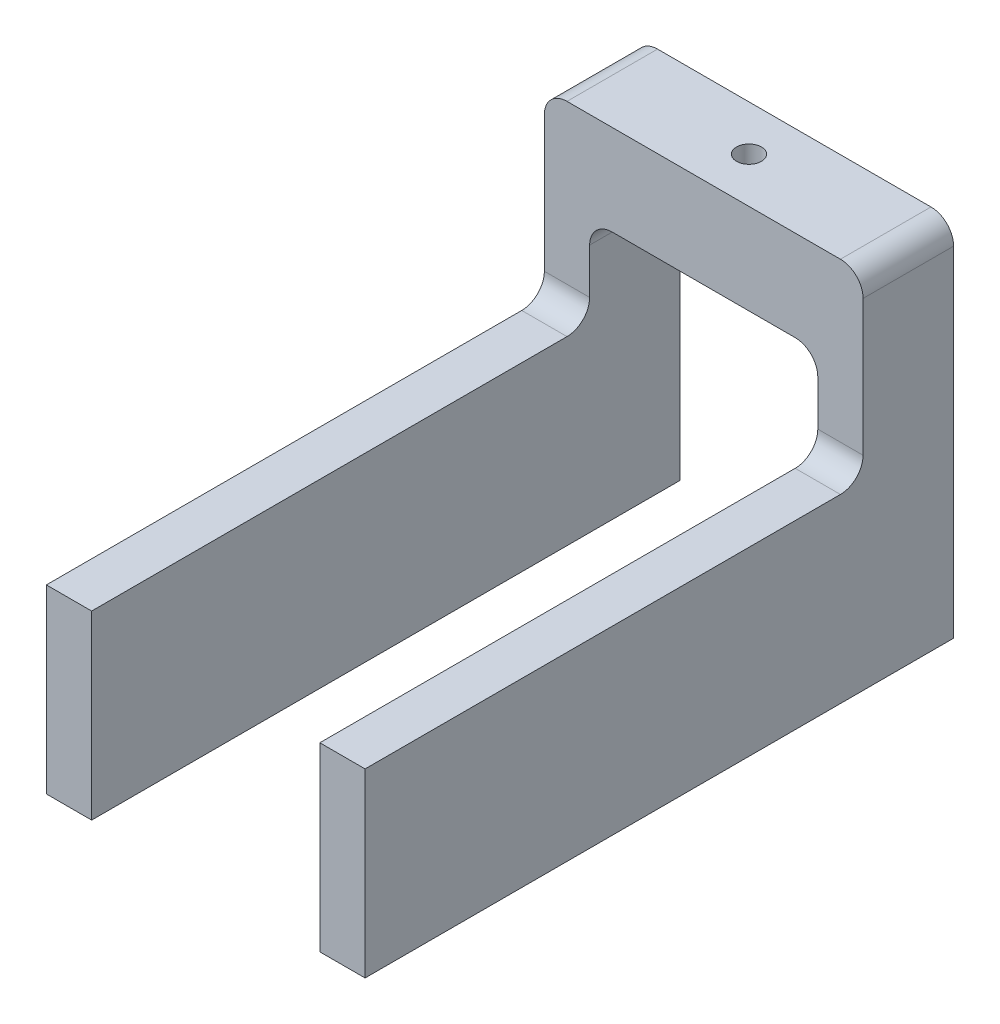
ISO-10303-21;
HEADER;
FILE_DESCRIPTION(('STEP AP214'),'2;1');
FILE_NAME('part.step','',(''),(''),'','','');
FILE_SCHEMA(('AUTOMOTIVE_DESIGN { 1 0 10303 214 1 1 1 1 }'));
ENDSEC;
DATA;
#1=APPLICATION_CONTEXT('core data for automotive mechanical design processes');
#2=APPLICATION_PROTOCOL_DEFINITION('international standard','automotive_design',2000,#1);
#3=PRODUCT_CONTEXT('',#1,'mechanical');
#4=PRODUCT('Part','Part','',(#3));
#5=PRODUCT_RELATED_PRODUCT_CATEGORY('part','',(#4));
#6=PRODUCT_DEFINITION_FORMATION('','',#4);
#7=PRODUCT_DEFINITION_CONTEXT('part definition',#1,'design');
#8=PRODUCT_DEFINITION('design','',#6,#7);
#9=PRODUCT_DEFINITION_SHAPE('','',#8);
#10=(LENGTH_UNIT() NAMED_UNIT(*) SI_UNIT(.MILLI.,.METRE.));
#11=(NAMED_UNIT(*) PLANE_ANGLE_UNIT() SI_UNIT($,.RADIAN.));
#12=(NAMED_UNIT(*) SI_UNIT($,.STERADIAN.) SOLID_ANGLE_UNIT());
#13=UNCERTAINTY_MEASURE_WITH_UNIT(LENGTH_MEASURE(1.E-05),#10,'distance_accuracy_value','');
#14=(GEOMETRIC_REPRESENTATION_CONTEXT(3) GLOBAL_UNCERTAINTY_ASSIGNED_CONTEXT((#13)) GLOBAL_UNIT_ASSIGNED_CONTEXT((#10,
#11,#12)) REPRESENTATION_CONTEXT('',''));
#15=CARTESIAN_POINT('',(0.,0.,0.));
#16=DIRECTION('',(0.,0.,1.));
#17=DIRECTION('',(1.,0.,0.));
#18=AXIS2_PLACEMENT_3D('',#15,#16,#17);
#19=CARTESIAN_POINT('',(89.408,50.8,165.1));
#20=DIRECTION('',(0.,-1.,0.));
#21=DIRECTION('',(0.,0.,-1.));
#22=AXIS2_PLACEMENT_3D('',#19,#20,#21);
#23=PLANE('',#22);
#24=DIRECTION('',(0.,0.,1.));
#25=VECTOR('',#24,1.);
#26=CARTESIAN_POINT('',(89.408,50.8,165.1));
#27=LINE('',#26,#25);
#28=CARTESIAN_POINT('',(89.408,50.8,31.75));
#29=VERTEX_POINT('',#28);
#30=CARTESIAN_POINT('',(89.408,50.8,165.1));
#31=VERTEX_POINT('',#30);
#32=EDGE_CURVE('E307',#29,#31,#27,.T.);
#33=ORIENTED_EDGE('',*,*,#32,.F.);
#34=DIRECTION('',(-1.,0.,0.));
#35=VECTOR('',#34,1.);
#36=CARTESIAN_POINT('',(76.708,50.8,31.75));
#37=LINE('',#36,#35);
#38=CARTESIAN_POINT('',(76.708,50.8,31.75));
#39=VERTEX_POINT('',#38);
#40=EDGE_CURVE('E270',#29,#39,#37,.T.);
#41=ORIENTED_EDGE('',*,*,#40,.T.);
#42=DIRECTION('',(0.,0.,1.));
#43=VECTOR('',#42,1.);
#44=CARTESIAN_POINT('',(76.708,50.8,165.1));
#45=LINE('',#44,#43);
#46=CARTESIAN_POINT('',(76.708,50.8,165.1));
#47=VERTEX_POINT('',#46);
#48=EDGE_CURVE('E293',#39,#47,#45,.T.);
#49=ORIENTED_EDGE('',*,*,#48,.T.);
#50=DIRECTION('',(-1.,0.,0.));
#51=VECTOR('',#50,1.);
#52=CARTESIAN_POINT('',(89.408,50.8,165.1));
#53=LINE('',#52,#51);
#54=EDGE_CURVE('E190',#31,#47,#53,.T.);
#55=ORIENTED_EDGE('',*,*,#54,.F.);
#56=EDGE_LOOP('',(#33,#41,#49,#55));
#57=FACE_BOUND('',#56,.T.);
#58=ADVANCED_FACE('F39',(#57),#23,.F.);
#59=CARTESIAN_POINT('',(89.408,0.,165.1));
#60=DIRECTION('',(0.,0.,-1.));
#61=DIRECTION('',(-1.,0.,0.));
#62=AXIS2_PLACEMENT_3D('',#59,#60,#61);
#63=PLANE('',#62);
#64=ORIENTED_EDGE('',*,*,#54,.T.);
#65=DIRECTION('',(0.,-1.,0.));
#66=VECTOR('',#65,1.);
#67=CARTESIAN_POINT('',(76.708,0.,165.1));
#68=LINE('',#67,#66);
#69=CARTESIAN_POINT('',(76.708,0.,165.1));
#70=VERTEX_POINT('',#69);
#71=EDGE_CURVE('E170',#47,#70,#68,.T.);
#72=ORIENTED_EDGE('',*,*,#71,.T.);
#73=DIRECTION('',(-1.,0.,0.));
#74=VECTOR('',#73,1.);
#75=CARTESIAN_POINT('',(89.408,0.,165.1));
#76=LINE('',#75,#74);
#77=CARTESIAN_POINT('',(89.408,0.,165.1));
#78=VERTEX_POINT('',#77);
#79=EDGE_CURVE('E187',#78,#70,#76,.T.);
#80=ORIENTED_EDGE('',*,*,#79,.F.);
#81=DIRECTION('',(0.,-1.,0.));
#82=VECTOR('',#81,1.);
#83=CARTESIAN_POINT('',(89.408,0.,165.1));
#84=LINE('',#83,#82);
#85=EDGE_CURVE('E311',#31,#78,#84,.T.);
#86=ORIENTED_EDGE('',*,*,#85,.F.);
#87=EDGE_LOOP('',(#64,#72,#80,#86));
#88=FACE_BOUND('',#87,.T.);
#89=ADVANCED_FACE('F185',(#88),#63,.F.);
#90=CARTESIAN_POINT('',(89.408,0.,0.));
#91=DIRECTION('',(0.,1.,0.));
#92=DIRECTION('',(0.,0.,1.));
#93=AXIS2_PLACEMENT_3D('',#90,#91,#92);
#94=PLANE('',#93);
#95=ORIENTED_EDGE('',*,*,#79,.T.);
#96=DIRECTION('',(0.,0.,-1.));
#97=VECTOR('',#96,1.);
#98=CARTESIAN_POINT('',(76.708,0.,165.1));
#99=LINE('',#98,#97);
#100=CARTESIAN_POINT('',(76.708,0.,0.));
#101=VERTEX_POINT('',#100);
#102=EDGE_CURVE('E165',#70,#101,#99,.T.);
#103=ORIENTED_EDGE('',*,*,#102,.T.);
#104=DIRECTION('',(-1.,0.,0.));
#105=VECTOR('',#104,1.);
#106=CARTESIAN_POINT('',(89.408,0.,0.));
#107=LINE('',#106,#105);
#108=CARTESIAN_POINT('',(89.408,0.,0.));
#109=VERTEX_POINT('',#108);
#110=EDGE_CURVE('E204',#109,#101,#107,.T.);
#111=ORIENTED_EDGE('',*,*,#110,.F.);
#112=DIRECTION('',(0.,0.,-1.));
#113=VECTOR('',#112,1.);
#114=CARTESIAN_POINT('',(89.408,0.,0.));
#115=LINE('',#114,#113);
#116=EDGE_CURVE('E195',#78,#109,#115,.T.);
#117=ORIENTED_EDGE('',*,*,#116,.F.);
#118=EDGE_LOOP('',(#95,#103,#111,#117));
#119=FACE_BOUND('',#118,.T.);
#120=ADVANCED_FACE('F194',(#119),#94,.F.);
#121=CARTESIAN_POINT('',(89.408,101.6,0.));
#122=DIRECTION('',(0.,0.,1.));
#123=DIRECTION('',(0.,-1.,0.));
#124=AXIS2_PLACEMENT_3D('',#121,#122,#123);
#125=PLANE('',#124);
#126=DIRECTION('',(-1.,0.,0.));
#127=VECTOR('',#126,1.);
#128=CARTESIAN_POINT('',(89.408,101.6,0.));
#129=LINE('',#128,#127);
#130=CARTESIAN_POINT('',(83.058,101.6,0.));
#131=VERTEX_POINT('',#130);
#132=CARTESIAN_POINT('',(6.34999999999999,101.6,0.));
#133=VERTEX_POINT('',#132);
#134=EDGE_CURVE('E213',#131,#133,#129,.T.);
#135=ORIENTED_EDGE('',*,*,#134,.F.);
#136=CARTESIAN_POINT('',(83.058,95.25,0.));
#137=DIRECTION('',(0.,0.,1.));
#138=DIRECTION('',(0.,-1.,0.));
#139=AXIS2_PLACEMENT_3D('',#136,#137,#138);
#140=CIRCLE('',#139,6.35);
#141=CARTESIAN_POINT('',(89.408,95.25,0.));
#142=VERTEX_POINT('',#141);
#143=EDGE_CURVE('E247',#131,#142,#140,.F.);
#144=ORIENTED_EDGE('',*,*,#143,.T.);
#145=DIRECTION('',(0.,1.,0.));
#146=VECTOR('',#145,1.);
#147=CARTESIAN_POINT('',(89.408,101.6,0.));
#148=LINE('',#147,#146);
#149=EDGE_CURVE('E316',#109,#142,#148,.T.);
#150=ORIENTED_EDGE('',*,*,#149,.F.);
#151=ORIENTED_EDGE('',*,*,#110,.T.);
#152=DIRECTION('',(0.,-1.,0.));
#153=VECTOR('',#152,1.);
#154=CARTESIAN_POINT('',(76.708,0.,0.));
#155=LINE('',#154,#153);
#156=CARTESIAN_POINT('',(76.708,69.85,0.));
#157=VERTEX_POINT('',#156);
#158=EDGE_CURVE('E174',#157,#101,#155,.T.);
#159=ORIENTED_EDGE('',*,*,#158,.F.);
#160=CARTESIAN_POINT('',(70.358,69.85,0.));
#161=DIRECTION('',(0.,0.,1.));
#162=DIRECTION('',(0.,-1.,0.));
#163=AXIS2_PLACEMENT_3D('',#160,#161,#162);
#164=CIRCLE('',#163,6.35);
#165=CARTESIAN_POINT('',(70.358,76.2,0.));
#166=VERTEX_POINT('',#165);
#167=EDGE_CURVE('E273',#157,#166,#164,.T.);
#168=ORIENTED_EDGE('',*,*,#167,.T.);
#169=DIRECTION('',(1.,0.,0.));
#170=VECTOR('',#169,1.);
#171=CARTESIAN_POINT('',(76.708,76.2,0.));
#172=LINE('',#171,#170);
#173=CARTESIAN_POINT('',(19.05,76.2,0.));
#174=VERTEX_POINT('',#173);
#175=EDGE_CURVE('E359',#174,#166,#172,.T.);
#176=ORIENTED_EDGE('',*,*,#175,.F.);
#177=CARTESIAN_POINT('',(19.05,69.85,0.));
#178=DIRECTION('',(0.,0.,1.));
#179=DIRECTION('',(0.,-1.,0.));
#180=AXIS2_PLACEMENT_3D('',#177,#178,#179);
#181=CIRCLE('',#180,6.35);
#182=CARTESIAN_POINT('',(12.7,69.85,0.));
#183=VERTEX_POINT('',#182);
#184=EDGE_CURVE('E279',#174,#183,#181,.T.);
#185=ORIENTED_EDGE('',*,*,#184,.T.);
#186=DIRECTION('',(0.,1.,0.));
#187=VECTOR('',#186,1.);
#188=CARTESIAN_POINT('',(12.7,76.2,0.));
#189=LINE('',#188,#187);
#190=CARTESIAN_POINT('',(12.7,0.,0.));
#191=VERTEX_POINT('',#190);
#192=EDGE_CURVE('E363',#191,#183,#189,.T.);
#193=ORIENTED_EDGE('',*,*,#192,.F.);
#194=CARTESIAN_POINT('',(0.,0.,0.));
#195=VERTEX_POINT('',#194);
#196=EDGE_CURVE('E322',#191,#195,#107,.T.);
#197=ORIENTED_EDGE('',*,*,#196,.T.);
#198=DIRECTION('',(0.,1.,0.));
#199=VECTOR('',#198,1.);
#200=CARTESIAN_POINT('',(0.,101.6,0.));
#201=LINE('',#200,#199);
#202=CARTESIAN_POINT('',(0.,95.25,0.));
#203=VERTEX_POINT('',#202);
#204=EDGE_CURVE('E300',#195,#203,#201,.T.);
#205=ORIENTED_EDGE('',*,*,#204,.T.);
#206=CARTESIAN_POINT('',(6.34999999999999,95.25,0.));
#207=DIRECTION('',(0.,0.,1.));
#208=DIRECTION('',(0.,-1.,0.));
#209=AXIS2_PLACEMENT_3D('',#206,#207,#208);
#210=CIRCLE('',#209,6.35);
#211=EDGE_CURVE('E244',#203,#133,#210,.F.);
#212=ORIENTED_EDGE('',*,*,#211,.T.);
#213=EDGE_LOOP('',(#135,#144,#150,#151,#159,#168,#176,#185,#193,#197,#205,#212));
#214=FACE_BOUND('',#213,.T.);
#215=ADVANCED_FACE('F385',(#214),#125,.F.);
#216=CARTESIAN_POINT('',(89.408,101.6,25.4));
#217=DIRECTION('',(0.,-1.,0.));
#218=DIRECTION('',(0.,0.,-1.));
#219=AXIS2_PLACEMENT_3D('',#216,#217,#218);
#220=PLANE('',#219);
#221=CARTESIAN_POINT('',(44.704,101.6,12.7));
#222=DIRECTION('',(0.,1.,0.));
#223=DIRECTION('',(0.,0.,1.));
#224=AXIS2_PLACEMENT_3D('',#221,#222,#223);
#225=CIRCLE('',#224,3.49999999999999);
#226=CARTESIAN_POINT('',(44.704,101.6,16.2));
#227=VERTEX_POINT('',#226);
#228=EDGE_CURVE('E374',#227,#227,#225,.T.);
#229=ORIENTED_EDGE('',*,*,#228,.F.);
#230=EDGE_LOOP('',(#229));
#231=FACE_BOUND('',#230,.T.);
#232=DIRECTION('',(-1.,0.,0.));
#233=VECTOR('',#232,1.);
#234=CARTESIAN_POINT('',(89.408,101.6,25.4));
#235=LINE('',#234,#233);
#236=CARTESIAN_POINT('',(83.058,101.6,25.4));
#237=VERTEX_POINT('',#236);
#238=CARTESIAN_POINT('',(6.34999999999999,101.6,25.4));
#239=VERTEX_POINT('',#238);
#240=EDGE_CURVE('E209',#237,#239,#235,.T.);
#241=ORIENTED_EDGE('',*,*,#240,.F.);
#242=DIRECTION('',(0.,0.,1.));
#243=VECTOR('',#242,1.);
#244=CARTESIAN_POINT('',(83.058,101.6,25.4));
#245=LINE('',#244,#243);
#246=EDGE_CURVE('E241',#237,#131,#245,.F.);
#247=ORIENTED_EDGE('',*,*,#246,.T.);
#248=ORIENTED_EDGE('',*,*,#134,.T.);
#249=DIRECTION('',(0.,0.,1.));
#250=VECTOR('',#249,1.);
#251=CARTESIAN_POINT('',(6.34999999999999,101.6,25.4));
#252=LINE('',#251,#250);
#253=EDGE_CURVE('E237',#133,#239,#252,.T.);
#254=ORIENTED_EDGE('',*,*,#253,.T.);
#255=EDGE_LOOP('',(#241,#247,#248,#254));
#256=FACE_BOUND('',#255,.T.);
#257=ADVANCED_FACE('F382',(#231,#256),#220,.F.);
#258=CARTESIAN_POINT('',(89.408,50.8,25.4));
#259=DIRECTION('',(0.,0.,-1.));
#260=DIRECTION('',(-1.,0.,0.));
#261=AXIS2_PLACEMENT_3D('',#258,#259,#260);
#262=PLANE('',#261);
#263=DIRECTION('',(0.,-1.,0.));
#264=VECTOR('',#263,1.);
#265=CARTESIAN_POINT('',(89.408,50.8,25.4));
#266=LINE('',#265,#264);
#267=CARTESIAN_POINT('',(89.408,95.25,25.4));
#268=VERTEX_POINT('',#267);
#269=CARTESIAN_POINT('',(89.408,57.15,25.4));
#270=VERTEX_POINT('',#269);
#271=EDGE_CURVE('E308',#268,#270,#266,.T.);
#272=ORIENTED_EDGE('',*,*,#271,.F.);
#273=CARTESIAN_POINT('',(83.058,95.25,25.4));
#274=DIRECTION('',(0.,0.,-1.));
#275=DIRECTION('',(-1.,0.,0.));
#276=AXIS2_PLACEMENT_3D('',#273,#274,#275);
#277=CIRCLE('',#276,6.35);
#278=EDGE_CURVE('E234',#268,#237,#277,.F.);
#279=ORIENTED_EDGE('',*,*,#278,.T.);
#280=ORIENTED_EDGE('',*,*,#240,.T.);
#281=CARTESIAN_POINT('',(6.34999999999999,95.25,25.4));
#282=DIRECTION('',(0.,0.,-1.));
#283=DIRECTION('',(-1.,0.,0.));
#284=AXIS2_PLACEMENT_3D('',#281,#282,#283);
#285=CIRCLE('',#284,6.35);
#286=CARTESIAN_POINT('',(0.,95.25,25.4));
#287=VERTEX_POINT('',#286);
#288=EDGE_CURVE('E231',#239,#287,#285,.F.);
#289=ORIENTED_EDGE('',*,*,#288,.T.);
#290=DIRECTION('',(0.,-1.,0.));
#291=VECTOR('',#290,1.);
#292=CARTESIAN_POINT('',(0.,50.8,25.4));
#293=LINE('',#292,#291);
#294=CARTESIAN_POINT('',(0.,57.15,25.4));
#295=VERTEX_POINT('',#294);
#296=EDGE_CURVE('E326',#287,#295,#293,.T.);
#297=ORIENTED_EDGE('',*,*,#296,.T.);
#298=DIRECTION('',(-1.,0.,0.));
#299=VECTOR('',#298,1.);
#300=CARTESIAN_POINT('',(12.7,57.15,25.4));
#301=LINE('',#300,#299);
#302=CARTESIAN_POINT('',(12.7,57.15,25.4));
#303=VERTEX_POINT('',#302);
#304=EDGE_CURVE('E228',#295,#303,#301,.F.);
#305=ORIENTED_EDGE('',*,*,#304,.T.);
#306=DIRECTION('',(0.,1.,0.));
#307=VECTOR('',#306,1.);
#308=CARTESIAN_POINT('',(12.7,50.8,25.4));
#309=LINE('',#308,#307);
#310=CARTESIAN_POINT('',(12.7,69.85,25.4));
#311=VERTEX_POINT('',#310);
#312=EDGE_CURVE('E349',#303,#311,#309,.T.);
#313=ORIENTED_EDGE('',*,*,#312,.T.);
#314=CARTESIAN_POINT('',(19.05,69.85,25.4));
#315=DIRECTION('',(0.,0.,-1.));
#316=DIRECTION('',(-1.,0.,0.));
#317=AXIS2_PLACEMENT_3D('',#314,#315,#316);
#318=CIRCLE('',#317,6.35);
#319=CARTESIAN_POINT('',(19.05,76.2,25.4));
#320=VERTEX_POINT('',#319);
#321=EDGE_CURVE('E282',#311,#320,#318,.T.);
#322=ORIENTED_EDGE('',*,*,#321,.T.);
#323=DIRECTION('',(1.,0.,0.));
#324=VECTOR('',#323,1.);
#325=CARTESIAN_POINT('',(89.408,76.2,25.4));
#326=LINE('',#325,#324);
#327=CARTESIAN_POINT('',(70.358,76.2,25.4));
#328=VERTEX_POINT('',#327);
#329=EDGE_CURVE('E217',#320,#328,#326,.T.);
#330=ORIENTED_EDGE('',*,*,#329,.T.);
#331=CARTESIAN_POINT('',(70.358,69.85,25.4));
#332=DIRECTION('',(0.,0.,-1.));
#333=DIRECTION('',(-1.,0.,0.));
#334=AXIS2_PLACEMENT_3D('',#331,#332,#333);
#335=CIRCLE('',#334,6.35);
#336=CARTESIAN_POINT('',(76.708,69.85,25.4));
#337=VERTEX_POINT('',#336);
#338=EDGE_CURVE('E276',#328,#337,#335,.T.);
#339=ORIENTED_EDGE('',*,*,#338,.T.);
#340=DIRECTION('',(0.,-1.,0.));
#341=VECTOR('',#340,1.);
#342=CARTESIAN_POINT('',(76.708,50.8,25.4));
#343=LINE('',#342,#341);
#344=CARTESIAN_POINT('',(76.708,57.15,25.4));
#345=VERTEX_POINT('',#344);
#346=EDGE_CURVE('E291',#337,#345,#343,.T.);
#347=ORIENTED_EDGE('',*,*,#346,.T.);
#348=DIRECTION('',(-1.,0.,0.));
#349=VECTOR('',#348,1.);
#350=CARTESIAN_POINT('',(89.408,57.15,25.4));
#351=LINE('',#350,#349);
#352=EDGE_CURVE('E225',#345,#270,#351,.F.);
#353=ORIENTED_EDGE('',*,*,#352,.T.);
#354=EDGE_LOOP('',(#272,#279,#280,#289,#297,#305,#313,#322,#330,#339,#347,#353));
#355=FACE_BOUND('',#354,.T.);
#356=ADVANCED_FACE('F296',(#355),#262,.F.);
#357=DIRECTION('',(0.,0.,-1.));
#358=VECTOR('',#357,1.);
#359=CARTESIAN_POINT('',(12.7,50.8,165.1));
#360=LINE('',#359,#358);
#361=CARTESIAN_POINT('',(12.7,50.8,165.1));
#362=VERTEX_POINT('',#361);
#363=CARTESIAN_POINT('',(12.7,50.8,31.75));
#364=VERTEX_POINT('',#363);
#365=EDGE_CURVE('E180',#362,#364,#360,.T.);
#366=ORIENTED_EDGE('',*,*,#365,.T.);
#367=DIRECTION('',(-1.,0.,0.));
#368=VECTOR('',#367,1.);
#369=CARTESIAN_POINT('',(0.,50.8,31.75));
#370=LINE('',#369,#368);
#371=CARTESIAN_POINT('',(0.,50.8,31.75));
#372=VERTEX_POINT('',#371);
#373=EDGE_CURVE('E266',#364,#372,#370,.T.);
#374=ORIENTED_EDGE('',*,*,#373,.T.);
#375=DIRECTION('',(0.,0.,1.));
#376=VECTOR('',#375,1.);
#377=CARTESIAN_POINT('',(0.,50.8,165.1));
#378=LINE('',#377,#376);
#379=CARTESIAN_POINT('',(0.,50.8,165.1));
#380=VERTEX_POINT('',#379);
#381=EDGE_CURVE('E330',#372,#380,#378,.T.);
#382=ORIENTED_EDGE('',*,*,#381,.T.);
#383=EDGE_CURVE('E197',#362,#380,#53,.T.);
#384=ORIENTED_EDGE('',*,*,#383,.F.);
#385=EDGE_LOOP('',(#366,#374,#382,#384));
#386=FACE_BOUND('',#385,.T.);
#387=ADVANCED_FACE('F409',(#386),#23,.F.);
#388=CARTESIAN_POINT('',(12.7,0.,165.1));
#389=VERTEX_POINT('',#388);
#390=CARTESIAN_POINT('',(0.,0.,165.1));
#391=VERTEX_POINT('',#390);
#392=EDGE_CURVE('E198',#389,#391,#76,.T.);
#393=ORIENTED_EDGE('',*,*,#392,.F.);
#394=DIRECTION('',(0.,1.,0.));
#395=VECTOR('',#394,1.);
#396=CARTESIAN_POINT('',(12.7,76.2,165.1));
#397=LINE('',#396,#395);
#398=EDGE_CURVE('E192',#389,#362,#397,.T.);
#399=ORIENTED_EDGE('',*,*,#398,.T.);
#400=ORIENTED_EDGE('',*,*,#383,.T.);
#401=DIRECTION('',(0.,-1.,0.));
#402=VECTOR('',#401,1.);
#403=CARTESIAN_POINT('',(0.,0.,165.1));
#404=LINE('',#403,#402);
#405=EDGE_CURVE('E333',#380,#391,#404,.T.);
#406=ORIENTED_EDGE('',*,*,#405,.T.);
#407=EDGE_LOOP('',(#393,#399,#400,#406));
#408=FACE_BOUND('',#407,.T.);
#409=ADVANCED_FACE('F415',(#408),#63,.F.);
#410=ORIENTED_EDGE('',*,*,#196,.F.);
#411=DIRECTION('',(0.,0.,-1.));
#412=VECTOR('',#411,1.);
#413=CARTESIAN_POINT('',(12.7,0.,165.1));
#414=LINE('',#413,#412);
#415=EDGE_CURVE('E181',#389,#191,#414,.T.);
#416=ORIENTED_EDGE('',*,*,#415,.F.);
#417=ORIENTED_EDGE('',*,*,#392,.T.);
#418=DIRECTION('',(0.,0.,-1.));
#419=VECTOR('',#418,1.);
#420=CARTESIAN_POINT('',(0.,0.,0.));
#421=LINE('',#420,#419);
#422=EDGE_CURVE('E336',#391,#195,#421,.T.);
#423=ORIENTED_EDGE('',*,*,#422,.T.);
#424=EDGE_LOOP('',(#410,#416,#417,#423));
#425=FACE_BOUND('',#424,.T.);
#426=ADVANCED_FACE('F416',(#425),#94,.F.);
#427=CARTESIAN_POINT('',(89.408,0.,0.));
#428=DIRECTION('',(-1.,0.,0.));
#429=DIRECTION('',(0.,0.,1.));
#430=AXIS2_PLACEMENT_3D('',#427,#428,#429);
#431=PLANE('',#430);
#432=ORIENTED_EDGE('',*,*,#149,.T.);
#433=DIRECTION('',(0.,0.,1.));
#434=VECTOR('',#433,1.);
#435=CARTESIAN_POINT('',(89.408,95.25,0.));
#436=LINE('',#435,#434);
#437=EDGE_CURVE('E221',#142,#268,#436,.T.);
#438=ORIENTED_EDGE('',*,*,#437,.T.);
#439=ORIENTED_EDGE('',*,*,#271,.T.);
#440=CARTESIAN_POINT('',(89.408,57.15,31.75));
#441=DIRECTION('',(-1.,0.,0.));
#442=DIRECTION('',(0.,0.,1.));
#443=AXIS2_PLACEMENT_3D('',#440,#441,#442);
#444=CIRCLE('',#443,6.35);
#445=EDGE_CURVE('E11',#270,#29,#444,.T.);
#446=ORIENTED_EDGE('',*,*,#445,.T.);
#447=ORIENTED_EDGE('',*,*,#32,.T.);
#448=ORIENTED_EDGE('',*,*,#85,.T.);
#449=ORIENTED_EDGE('',*,*,#116,.T.);
#450=EDGE_LOOP('',(#432,#438,#439,#446,#447,#448,#449));
#451=FACE_BOUND('',#450,.T.);
#452=ADVANCED_FACE('F306',(#451),#431,.F.);
#453=CARTESIAN_POINT('',(0.,0.,0.));
#454=DIRECTION('',(-1.,0.,0.));
#455=DIRECTION('',(0.,0.,1.));
#456=AXIS2_PLACEMENT_3D('',#453,#454,#455);
#457=PLANE('',#456);
#458=ORIENTED_EDGE('',*,*,#296,.F.);
#459=DIRECTION('',(0.,0.,1.));
#460=VECTOR('',#459,1.);
#461=CARTESIAN_POINT('',(0.,95.25,0.));
#462=LINE('',#461,#460);
#463=EDGE_CURVE('E250',#287,#203,#462,.F.);
#464=ORIENTED_EDGE('',*,*,#463,.T.);
#465=ORIENTED_EDGE('',*,*,#204,.F.);
#466=ORIENTED_EDGE('',*,*,#422,.F.);
#467=ORIENTED_EDGE('',*,*,#405,.F.);
#468=ORIENTED_EDGE('',*,*,#381,.F.);
#469=CARTESIAN_POINT('',(0.,57.15,31.75));
#470=DIRECTION('',(-1.,0.,0.));
#471=DIRECTION('',(0.,0.,1.));
#472=AXIS2_PLACEMENT_3D('',#469,#470,#471);
#473=CIRCLE('',#472,6.35);
#474=EDGE_CURVE('E285',#372,#295,#473,.F.);
#475=ORIENTED_EDGE('',*,*,#474,.T.);
#476=EDGE_LOOP('',(#458,#464,#465,#466,#467,#468,#475));
#477=FACE_BOUND('',#476,.T.);
#478=ADVANCED_FACE('F402',(#477),#457,.T.);
#479=CARTESIAN_POINT('',(76.708,76.2,165.1));
#480=DIRECTION('',(0.,1.,0.));
#481=DIRECTION('',(0.,0.,1.));
#482=AXIS2_PLACEMENT_3D('',#479,#480,#481);
#483=PLANE('',#482);
#484=CARTESIAN_POINT('',(44.704,76.2,12.7));
#485=DIRECTION('',(0.,1.,0.));
#486=DIRECTION('',(0.,0.,1.));
#487=AXIS2_PLACEMENT_3D('',#484,#485,#486);
#488=CIRCLE('',#487,3.49999999999999);
#489=CARTESIAN_POINT('',(44.704,76.2,16.2));
#490=VERTEX_POINT('',#489);
#491=EDGE_CURVE('E366',#490,#490,#488,.T.);
#492=ORIENTED_EDGE('',*,*,#491,.T.);
#493=EDGE_LOOP('',(#492));
#494=FACE_BOUND('',#493,.T.);
#495=ORIENTED_EDGE('',*,*,#175,.T.);
#496=DIRECTION('',(0.,0.,-1.));
#497=VECTOR('',#496,1.);
#498=CARTESIAN_POINT('',(70.358,76.2,25.4));
#499=LINE('',#498,#497);
#500=EDGE_CURVE('E260',#166,#328,#499,.F.);
#501=ORIENTED_EDGE('',*,*,#500,.T.);
#502=ORIENTED_EDGE('',*,*,#329,.F.);
#503=DIRECTION('',(0.,0.,-1.));
#504=VECTOR('',#503,1.);
#505=CARTESIAN_POINT('',(19.05,76.2,0.));
#506=LINE('',#505,#504);
#507=EDGE_CURVE('E256',#320,#174,#506,.T.);
#508=ORIENTED_EDGE('',*,*,#507,.T.);
#509=EDGE_LOOP('',(#495,#501,#502,#508));
#510=FACE_BOUND('',#509,.T.);
#511=ADVANCED_FACE('F426',(#494,#510),#483,.F.);
#512=CARTESIAN_POINT('',(76.708,0.,165.1));
#513=DIRECTION('',(1.,0.,0.));
#514=DIRECTION('',(0.,0.,-1.));
#515=AXIS2_PLACEMENT_3D('',#512,#513,#514);
#516=PLANE('',#515);
#517=ORIENTED_EDGE('',*,*,#346,.F.);
#518=DIRECTION('',(0.,0.,-1.));
#519=VECTOR('',#518,1.);
#520=CARTESIAN_POINT('',(76.708,69.85,0.));
#521=LINE('',#520,#519);
#522=EDGE_CURVE('E253',#337,#157,#521,.T.);
#523=ORIENTED_EDGE('',*,*,#522,.T.);
#524=ORIENTED_EDGE('',*,*,#158,.T.);
#525=ORIENTED_EDGE('',*,*,#102,.F.);
#526=ORIENTED_EDGE('',*,*,#71,.F.);
#527=ORIENTED_EDGE('',*,*,#48,.F.);
#528=CARTESIAN_POINT('',(76.708,57.15,31.75));
#529=DIRECTION('',(1.,0.,0.));
#530=DIRECTION('',(0.,0.,-1.));
#531=AXIS2_PLACEMENT_3D('',#528,#529,#530);
#532=CIRCLE('',#531,6.35);
#533=EDGE_CURVE('E48',#39,#345,#532,.T.);
#534=ORIENTED_EDGE('',*,*,#533,.T.);
#535=EDGE_LOOP('',(#517,#523,#524,#525,#526,#527,#534));
#536=FACE_BOUND('',#535,.T.);
#537=ADVANCED_FACE('F168',(#536),#516,.F.);
#538=CARTESIAN_POINT('',(12.7,76.2,165.1));
#539=DIRECTION('',(-1.,0.,0.));
#540=DIRECTION('',(0.,-1.,0.));
#541=AXIS2_PLACEMENT_3D('',#538,#539,#540);
#542=PLANE('',#541);
#543=ORIENTED_EDGE('',*,*,#192,.T.);
#544=DIRECTION('',(0.,0.,-1.));
#545=VECTOR('',#544,1.);
#546=CARTESIAN_POINT('',(12.7,69.85,25.4));
#547=LINE('',#546,#545);
#548=EDGE_CURVE('E263',#183,#311,#547,.F.);
#549=ORIENTED_EDGE('',*,*,#548,.T.);
#550=ORIENTED_EDGE('',*,*,#312,.F.);
#551=CARTESIAN_POINT('',(12.7,57.15,31.75));
#552=DIRECTION('',(-1.,0.,0.));
#553=DIRECTION('',(0.,-1.,0.));
#554=AXIS2_PLACEMENT_3D('',#551,#552,#553);
#555=CIRCLE('',#554,6.35);
#556=EDGE_CURVE('E55',#303,#364,#555,.T.);
#557=ORIENTED_EDGE('',*,*,#556,.T.);
#558=ORIENTED_EDGE('',*,*,#365,.F.);
#559=ORIENTED_EDGE('',*,*,#398,.F.);
#560=ORIENTED_EDGE('',*,*,#415,.T.);
#561=EDGE_LOOP('',(#543,#549,#550,#557,#558,#559,#560));
#562=FACE_BOUND('',#561,.T.);
#563=ADVANCED_FACE('F411',(#562),#542,.F.);
#564=CARTESIAN_POINT('',(44.704,101.6,12.7));
#565=DIRECTION('',(0.,1.,0.));
#566=DIRECTION('',(0.,0.,1.));
#567=AXIS2_PLACEMENT_3D('',#564,#565,#566);
#568=CYLINDRICAL_SURFACE('',#567,3.49999999999999);
#569=ORIENTED_EDGE('',*,*,#228,.T.);
#570=EDGE_LOOP('',(#569));
#571=FACE_BOUND('',#570,.T.);
#572=ORIENTED_EDGE('',*,*,#491,.F.);
#573=EDGE_LOOP('',(#572));
#574=FACE_BOUND('',#573,.T.);
#575=ADVANCED_FACE('F379',(#571,#574),#568,.F.);
#576=CARTESIAN_POINT('',(83.058,95.25,0.));
#577=DIRECTION('',(0.,0.,1.));
#578=DIRECTION('',(1.,0.,0.));
#579=AXIS2_PLACEMENT_3D('',#576,#577,#578);
#580=CYLINDRICAL_SURFACE('',#579,6.35);
#581=ORIENTED_EDGE('',*,*,#143,.F.);
#582=ORIENTED_EDGE('',*,*,#246,.F.);
#583=ORIENTED_EDGE('',*,*,#278,.F.);
#584=ORIENTED_EDGE('',*,*,#437,.F.);
#585=EDGE_LOOP('',(#581,#582,#583,#584));
#586=FACE_BOUND('',#585,.T.);
#587=ADVANCED_FACE('F393',(#586),#580,.T.);
#588=CARTESIAN_POINT('',(6.34999999999999,95.25,25.4));
#589=DIRECTION('',(0.,0.,-1.));
#590=DIRECTION('',(-1.,0.,0.));
#591=AXIS2_PLACEMENT_3D('',#588,#589,#590);
#592=CYLINDRICAL_SURFACE('',#591,6.35);
#593=ORIENTED_EDGE('',*,*,#211,.F.);
#594=ORIENTED_EDGE('',*,*,#463,.F.);
#595=ORIENTED_EDGE('',*,*,#288,.F.);
#596=ORIENTED_EDGE('',*,*,#253,.F.);
#597=EDGE_LOOP('',(#593,#594,#595,#596));
#598=FACE_BOUND('',#597,.T.);
#599=ADVANCED_FACE('F397',(#598),#592,.T.);
#600=CARTESIAN_POINT('',(70.358,69.85,165.1));
#601=DIRECTION('',(0.,0.,1.));
#602=DIRECTION('',(0.,-1.,0.));
#603=AXIS2_PLACEMENT_3D('',#600,#601,#602);
#604=CYLINDRICAL_SURFACE('',#603,6.35);
#605=ORIENTED_EDGE('',*,*,#338,.F.);
#606=ORIENTED_EDGE('',*,*,#500,.F.);
#607=ORIENTED_EDGE('',*,*,#167,.F.);
#608=ORIENTED_EDGE('',*,*,#522,.F.);
#609=EDGE_LOOP('',(#605,#606,#607,#608));
#610=FACE_BOUND('',#609,.T.);
#611=ADVANCED_FACE('F429',(#610),#604,.F.);
#612=CARTESIAN_POINT('',(19.05,69.85,165.1));
#613=DIRECTION('',(0.,0.,1.));
#614=DIRECTION('',(0.,-1.,0.));
#615=AXIS2_PLACEMENT_3D('',#612,#613,#614);
#616=CYLINDRICAL_SURFACE('',#615,6.35);
#617=ORIENTED_EDGE('',*,*,#321,.F.);
#618=ORIENTED_EDGE('',*,*,#548,.F.);
#619=ORIENTED_EDGE('',*,*,#184,.F.);
#620=ORIENTED_EDGE('',*,*,#507,.F.);
#621=EDGE_LOOP('',(#617,#618,#619,#620));
#622=FACE_BOUND('',#621,.T.);
#623=ADVANCED_FACE('F423',(#622),#616,.F.);
#624=CARTESIAN_POINT('',(89.408,57.15,31.75));
#625=DIRECTION('',(1.,0.,0.));
#626=DIRECTION('',(0.,0.,-1.));
#627=AXIS2_PLACEMENT_3D('',#624,#625,#626);
#628=CYLINDRICAL_SURFACE('',#627,6.35);
#629=ORIENTED_EDGE('',*,*,#556,.F.);
#630=ORIENTED_EDGE('',*,*,#304,.F.);
#631=ORIENTED_EDGE('',*,*,#474,.F.);
#632=ORIENTED_EDGE('',*,*,#373,.F.);
#633=EDGE_LOOP('',(#629,#630,#631,#632));
#634=FACE_BOUND('',#633,.T.);
#635=ADVANCED_FACE('F407',(#634),#628,.F.);
#636=CARTESIAN_POINT('',(89.408,57.15,31.75));
#637=DIRECTION('',(1.,0.,0.));
#638=DIRECTION('',(0.,0.,-1.));
#639=AXIS2_PLACEMENT_3D('',#636,#637,#638);
#640=CYLINDRICAL_SURFACE('',#639,6.35);
#641=ORIENTED_EDGE('',*,*,#445,.F.);
#642=ORIENTED_EDGE('',*,*,#352,.F.);
#643=ORIENTED_EDGE('',*,*,#533,.F.);
#644=ORIENTED_EDGE('',*,*,#40,.F.);
#645=EDGE_LOOP('',(#641,#642,#643,#644));
#646=FACE_BOUND('',#645,.T.);
#647=ADVANCED_FACE('F41',(#646),#640,.F.);
#648=CLOSED_SHELL('',(#58,#89,#120,#215,#257,#356,#387,#409,#426,#452,#478,#511,#537,#563,#575,
#587,#599,#611,#623,#635,#647));
#649=MANIFOLD_SOLID_BREP('B2',#648);
#650=ADVANCED_BREP_SHAPE_REPRESENTATION('',(#18,#649),#14);
#651=SHAPE_DEFINITION_REPRESENTATION(#9,#650);
ENDSEC;
END-ISO-10303-21;
